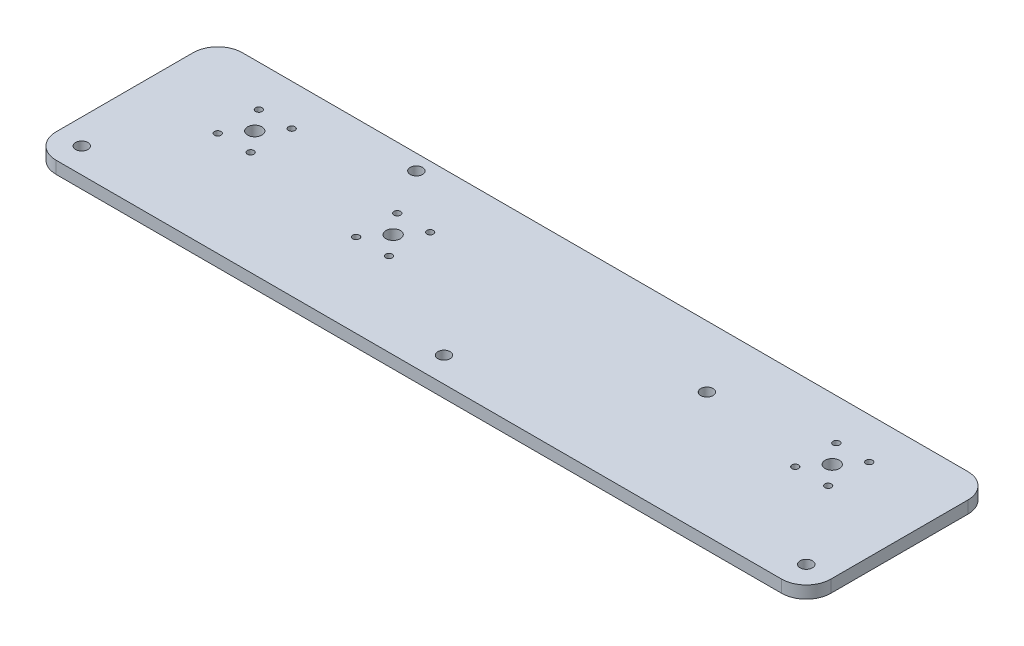
ISO-10303-21;
HEADER;
FILE_DESCRIPTION(('STEP AP214'),'2;1');
FILE_NAME('part.step','',(''),(''),'','','');
FILE_SCHEMA(('AUTOMOTIVE_DESIGN { 1 0 10303 214 1 1 1 1 }'));
ENDSEC;
DATA;
#1=APPLICATION_CONTEXT('core data for automotive mechanical design processes');
#2=APPLICATION_PROTOCOL_DEFINITION('international standard','automotive_design',2000,#1);
#3=PRODUCT_CONTEXT('',#1,'mechanical');
#4=PRODUCT('Part','Part','',(#3));
#5=PRODUCT_RELATED_PRODUCT_CATEGORY('part','',(#4));
#6=PRODUCT_DEFINITION_FORMATION('','',#4);
#7=PRODUCT_DEFINITION_CONTEXT('part definition',#1,'design');
#8=PRODUCT_DEFINITION('design','',#6,#7);
#9=PRODUCT_DEFINITION_SHAPE('','',#8);
#10=(LENGTH_UNIT() NAMED_UNIT(*) SI_UNIT(.MILLI.,.METRE.));
#11=(NAMED_UNIT(*) PLANE_ANGLE_UNIT() SI_UNIT($,.RADIAN.));
#12=(NAMED_UNIT(*) SI_UNIT($,.STERADIAN.) SOLID_ANGLE_UNIT());
#13=UNCERTAINTY_MEASURE_WITH_UNIT(LENGTH_MEASURE(1.E-05),#10,'distance_accuracy_value','');
#14=(GEOMETRIC_REPRESENTATION_CONTEXT(3) GLOBAL_UNCERTAINTY_ASSIGNED_CONTEXT((#13)) GLOBAL_UNIT_ASSIGNED_CONTEXT((#10,
#11,#12)) REPRESENTATION_CONTEXT('',''));
#15=CARTESIAN_POINT('',(0.,0.,0.));
#16=DIRECTION('',(0.,0.,1.));
#17=DIRECTION('',(1.,0.,0.));
#18=AXIS2_PLACEMENT_3D('',#15,#16,#17);
#19=CARTESIAN_POINT('',(176.965018959203,-6.,38.6486976408852));
#20=DIRECTION('',(0.,1.,0.));
#21=DIRECTION('',(0.,0.,1.));
#22=AXIS2_PLACEMENT_3D('',#19,#20,#21);
#23=CYLINDRICAL_SURFACE('',#22,12.);
#24=CARTESIAN_POINT('',(176.965018959203,0.,38.6486976408852));
#25=DIRECTION('',(0.,1.,0.));
#26=DIRECTION('',(0.,0.,1.));
#27=AXIS2_PLACEMENT_3D('',#24,#25,#26);
#28=CIRCLE('',#27,12.);
#29=CARTESIAN_POINT('',(176.965018959203,0.,50.6486976408852));
#30=VERTEX_POINT('',#29);
#31=CARTESIAN_POINT('',(188.965018959203,0.,38.6486976408851));
#32=VERTEX_POINT('',#31);
#33=EDGE_CURVE('E130',#30,#32,#28,.T.);
#34=ORIENTED_EDGE('',*,*,#33,.F.);
#35=DIRECTION('',(0.,1.,0.));
#36=VECTOR('',#35,1.);
#37=CARTESIAN_POINT('',(176.965018959203,-6.,50.6486976408852));
#38=LINE('',#37,#36);
#39=CARTESIAN_POINT('',(176.965018959203,-6.,50.6486976408852));
#40=VERTEX_POINT('',#39);
#41=EDGE_CURVE('E11',#40,#30,#38,.T.);
#42=ORIENTED_EDGE('',*,*,#41,.F.);
#43=CARTESIAN_POINT('',(176.965018959203,-6.,38.6486976408852));
#44=DIRECTION('',(0.,1.,0.));
#45=DIRECTION('',(0.,0.,1.));
#46=AXIS2_PLACEMENT_3D('',#43,#44,#45);
#47=CIRCLE('',#46,12.);
#48=CARTESIAN_POINT('',(188.965018959203,-6.,38.6486976408851));
#49=VERTEX_POINT('',#48);
#50=EDGE_CURVE('E151',#40,#49,#47,.T.);
#51=ORIENTED_EDGE('',*,*,#50,.T.);
#52=DIRECTION('',(0.,1.,0.));
#53=VECTOR('',#52,1.);
#54=CARTESIAN_POINT('',(188.965018959203,-6.,38.6486976408851));
#55=LINE('',#54,#53);
#56=EDGE_CURVE('E36',#49,#32,#55,.T.);
#57=ORIENTED_EDGE('',*,*,#56,.T.);
#58=EDGE_LOOP('',(#34,#42,#51,#57));
#59=FACE_BOUND('',#58,.T.);
#60=ADVANCED_FACE('F33',(#59),#23,.T.);
#61=CARTESIAN_POINT('',(-176.090826952667,-6.,50.6486976408852));
#62=DIRECTION('',(0.,0.,1.));
#63=DIRECTION('',(1.,0.,0.));
#64=AXIS2_PLACEMENT_3D('',#61,#62,#63);
#65=PLANE('',#64);
#66=DIRECTION('',(1.,0.,0.));
#67=VECTOR('',#66,1.);
#68=CARTESIAN_POINT('',(-176.090826952667,0.,50.6486976408852));
#69=LINE('',#68,#67);
#70=CARTESIAN_POINT('',(-176.090826952667,0.,50.6486976408852));
#71=VERTEX_POINT('',#70);
#72=EDGE_CURVE('E149',#71,#30,#69,.T.);
#73=ORIENTED_EDGE('',*,*,#72,.F.);
#74=DIRECTION('',(0.,1.,0.));
#75=VECTOR('',#74,1.);
#76=CARTESIAN_POINT('',(-176.090826952667,-6.,50.6486976408852));
#77=LINE('',#76,#75);
#78=CARTESIAN_POINT('',(-176.090826952667,-6.,50.6486976408852));
#79=VERTEX_POINT('',#78);
#80=EDGE_CURVE('E42',#79,#71,#77,.T.);
#81=ORIENTED_EDGE('',*,*,#80,.F.);
#82=DIRECTION('',(1.,0.,0.));
#83=VECTOR('',#82,1.);
#84=CARTESIAN_POINT('',(-176.090826952667,-6.,50.6486976408852));
#85=LINE('',#84,#83);
#86=EDGE_CURVE('E120',#79,#40,#85,.T.);
#87=ORIENTED_EDGE('',*,*,#86,.T.);
#88=ORIENTED_EDGE('',*,*,#41,.T.);
#89=EDGE_LOOP('',(#73,#81,#87,#88));
#90=FACE_BOUND('',#89,.T.);
#91=ADVANCED_FACE('F163',(#90),#65,.T.);
#92=CARTESIAN_POINT('',(-176.090826952667,-6.,38.6486976408852));
#93=DIRECTION('',(0.,1.,0.));
#94=DIRECTION('',(0.,0.,1.));
#95=AXIS2_PLACEMENT_3D('',#92,#93,#94);
#96=CYLINDRICAL_SURFACE('',#95,12.);
#97=CARTESIAN_POINT('',(-176.090826952667,0.,38.6486976408852));
#98=DIRECTION('',(0.,1.,0.));
#99=DIRECTION('',(0.,0.,1.));
#100=AXIS2_PLACEMENT_3D('',#97,#98,#99);
#101=CIRCLE('',#100,12.);
#102=CARTESIAN_POINT('',(-188.090826952667,0.,38.6486976408851));
#103=VERTEX_POINT('',#102);
#104=EDGE_CURVE('E107',#103,#71,#101,.T.);
#105=ORIENTED_EDGE('',*,*,#104,.F.);
#106=DIRECTION('',(0.,1.,0.));
#107=VECTOR('',#106,1.);
#108=CARTESIAN_POINT('',(-188.090826952667,-6.,38.6486976408851));
#109=LINE('',#108,#107);
#110=CARTESIAN_POINT('',(-188.090826952667,-6.,38.6486976408851));
#111=VERTEX_POINT('',#110);
#112=EDGE_CURVE('E102',#111,#103,#109,.T.);
#113=ORIENTED_EDGE('',*,*,#112,.F.);
#114=CARTESIAN_POINT('',(-176.090826952667,-6.,38.6486976408852));
#115=DIRECTION('',(0.,1.,0.));
#116=DIRECTION('',(0.,0.,1.));
#117=AXIS2_PLACEMENT_3D('',#114,#115,#116);
#118=CIRCLE('',#117,12.);
#119=EDGE_CURVE('E105',#111,#79,#118,.T.);
#120=ORIENTED_EDGE('',*,*,#119,.T.);
#121=ORIENTED_EDGE('',*,*,#80,.T.);
#122=EDGE_LOOP('',(#105,#113,#120,#121));
#123=FACE_BOUND('',#122,.T.);
#124=ADVANCED_FACE('F104',(#123),#96,.T.);
#125=CARTESIAN_POINT('',(-188.090826952667,-6.,-27.9999999999999));
#126=DIRECTION('',(-1.,0.,0.));
#127=DIRECTION('',(0.,0.,1.));
#128=AXIS2_PLACEMENT_3D('',#125,#126,#127);
#129=PLANE('',#128);
#130=DIRECTION('',(0.,0.,1.));
#131=VECTOR('',#130,1.);
#132=CARTESIAN_POINT('',(-188.090826952667,0.,-27.9999999999999));
#133=LINE('',#132,#131);
#134=CARTESIAN_POINT('',(-188.090826952667,0.,-27.9999999999999));
#135=VERTEX_POINT('',#134);
#136=EDGE_CURVE('E146',#135,#103,#133,.T.);
#137=ORIENTED_EDGE('',*,*,#136,.F.);
#138=DIRECTION('',(0.,1.,0.));
#139=VECTOR('',#138,1.);
#140=CARTESIAN_POINT('',(-188.090826952667,-6.,-27.9999999999999));
#141=LINE('',#140,#139);
#142=CARTESIAN_POINT('',(-188.090826952667,-6.,-27.9999999999999));
#143=VERTEX_POINT('',#142);
#144=EDGE_CURVE('E112',#143,#135,#141,.T.);
#145=ORIENTED_EDGE('',*,*,#144,.F.);
#146=DIRECTION('',(0.,0.,1.));
#147=VECTOR('',#146,1.);
#148=CARTESIAN_POINT('',(-188.090826952667,-6.,-27.9999999999999));
#149=LINE('',#148,#147);
#150=EDGE_CURVE('E118',#143,#111,#149,.T.);
#151=ORIENTED_EDGE('',*,*,#150,.T.);
#152=ORIENTED_EDGE('',*,*,#112,.T.);
#153=EDGE_LOOP('',(#137,#145,#151,#152));
#154=FACE_BOUND('',#153,.T.);
#155=ADVANCED_FACE('F122',(#154),#129,.T.);
#156=CARTESIAN_POINT('',(-176.090826952667,-6.,-28.));
#157=DIRECTION('',(0.,1.,0.));
#158=DIRECTION('',(0.,0.,1.));
#159=AXIS2_PLACEMENT_3D('',#156,#157,#158);
#160=CYLINDRICAL_SURFACE('',#159,12.);
#161=CARTESIAN_POINT('',(-176.090826952667,0.,-28.));
#162=DIRECTION('',(0.,1.,0.));
#163=DIRECTION('',(0.,0.,-1.));
#164=AXIS2_PLACEMENT_3D('',#161,#162,#163);
#165=CIRCLE('',#164,12.);
#166=CARTESIAN_POINT('',(-176.090826952667,0.,-40.));
#167=VERTEX_POINT('',#166);
#168=EDGE_CURVE('E143',#167,#135,#165,.T.);
#169=ORIENTED_EDGE('',*,*,#168,.F.);
#170=DIRECTION('',(0.,1.,0.));
#171=VECTOR('',#170,1.);
#172=CARTESIAN_POINT('',(-176.090826952667,-6.,-40.));
#173=LINE('',#172,#171);
#174=CARTESIAN_POINT('',(-176.090826952667,-6.,-40.));
#175=VERTEX_POINT('',#174);
#176=EDGE_CURVE('E155',#175,#167,#173,.T.);
#177=ORIENTED_EDGE('',*,*,#176,.F.);
#178=CARTESIAN_POINT('',(-176.090826952667,-6.,-28.));
#179=DIRECTION('',(0.,1.,0.));
#180=DIRECTION('',(0.,0.,-1.));
#181=AXIS2_PLACEMENT_3D('',#178,#179,#180);
#182=CIRCLE('',#181,12.);
#183=EDGE_CURVE('E123',#175,#143,#182,.T.);
#184=ORIENTED_EDGE('',*,*,#183,.T.);
#185=ORIENTED_EDGE('',*,*,#144,.T.);
#186=EDGE_LOOP('',(#169,#177,#184,#185));
#187=FACE_BOUND('',#186,.T.);
#188=ADVANCED_FACE('F176',(#187),#160,.T.);
#189=CARTESIAN_POINT('',(176.965018959203,-6.,-40.));
#190=DIRECTION('',(0.,0.,-1.));
#191=DIRECTION('',(-1.,0.,0.));
#192=AXIS2_PLACEMENT_3D('',#189,#190,#191);
#193=PLANE('',#192);
#194=DIRECTION('',(-1.,0.,0.));
#195=VECTOR('',#194,1.);
#196=CARTESIAN_POINT('',(176.965018959203,0.,-40.));
#197=LINE('',#196,#195);
#198=CARTESIAN_POINT('',(176.965018959203,0.,-40.));
#199=VERTEX_POINT('',#198);
#200=EDGE_CURVE('E140',#199,#167,#197,.T.);
#201=ORIENTED_EDGE('',*,*,#200,.F.);
#202=DIRECTION('',(0.,1.,0.));
#203=VECTOR('',#202,1.);
#204=CARTESIAN_POINT('',(176.965018959203,-6.,-40.));
#205=LINE('',#204,#203);
#206=CARTESIAN_POINT('',(176.965018959203,-6.,-40.));
#207=VERTEX_POINT('',#206);
#208=EDGE_CURVE('E157',#207,#199,#205,.T.);
#209=ORIENTED_EDGE('',*,*,#208,.F.);
#210=DIRECTION('',(-1.,0.,0.));
#211=VECTOR('',#210,1.);
#212=CARTESIAN_POINT('',(176.965018959203,-6.,-40.));
#213=LINE('',#212,#211);
#214=EDGE_CURVE('E125',#207,#175,#213,.T.);
#215=ORIENTED_EDGE('',*,*,#214,.T.);
#216=ORIENTED_EDGE('',*,*,#176,.T.);
#217=EDGE_LOOP('',(#201,#209,#215,#216));
#218=FACE_BOUND('',#217,.T.);
#219=ADVANCED_FACE('F179',(#218),#193,.T.);
#220=CARTESIAN_POINT('',(176.965018959203,-6.,-28.));
#221=DIRECTION('',(0.,1.,0.));
#222=DIRECTION('',(0.,0.,1.));
#223=AXIS2_PLACEMENT_3D('',#220,#221,#222);
#224=CYLINDRICAL_SURFACE('',#223,12.);
#225=CARTESIAN_POINT('',(176.965018959203,0.,-28.));
#226=DIRECTION('',(0.,1.,0.));
#227=DIRECTION('',(0.,0.,1.));
#228=AXIS2_PLACEMENT_3D('',#225,#226,#227);
#229=CIRCLE('',#228,12.);
#230=CARTESIAN_POINT('',(188.965018959203,0.,-27.9999999999999));
#231=VERTEX_POINT('',#230);
#232=EDGE_CURVE('E137',#231,#199,#229,.T.);
#233=ORIENTED_EDGE('',*,*,#232,.F.);
#234=DIRECTION('',(0.,1.,0.));
#235=VECTOR('',#234,1.);
#236=CARTESIAN_POINT('',(188.965018959203,-6.,-27.9999999999999));
#237=LINE('',#236,#235);
#238=CARTESIAN_POINT('',(188.965018959203,-6.,-27.9999999999999));
#239=VERTEX_POINT('',#238);
#240=EDGE_CURVE('E158',#239,#231,#237,.T.);
#241=ORIENTED_EDGE('',*,*,#240,.F.);
#242=CARTESIAN_POINT('',(176.965018959203,-6.,-28.));
#243=DIRECTION('',(0.,1.,0.));
#244=DIRECTION('',(0.,0.,1.));
#245=AXIS2_PLACEMENT_3D('',#242,#243,#244);
#246=CIRCLE('',#245,12.);
#247=EDGE_CURVE('E405',#239,#207,#246,.T.);
#248=ORIENTED_EDGE('',*,*,#247,.T.);
#249=ORIENTED_EDGE('',*,*,#208,.T.);
#250=EDGE_LOOP('',(#233,#241,#248,#249));
#251=FACE_BOUND('',#250,.T.);
#252=ADVANCED_FACE('F183',(#251),#224,.T.);
#253=CARTESIAN_POINT('',(188.965018959203,-6.,38.6486976408851));
#254=DIRECTION('',(1.,0.,0.));
#255=DIRECTION('',(0.,0.,-1.));
#256=AXIS2_PLACEMENT_3D('',#253,#254,#255);
#257=PLANE('',#256);
#258=DIRECTION('',(0.,0.,-1.));
#259=VECTOR('',#258,1.);
#260=CARTESIAN_POINT('',(188.965018959203,0.,38.6486976408851));
#261=LINE('',#260,#259);
#262=EDGE_CURVE('E133',#32,#231,#261,.T.);
#263=ORIENTED_EDGE('',*,*,#262,.F.);
#264=ORIENTED_EDGE('',*,*,#56,.F.);
#265=DIRECTION('',(0.,0.,-1.));
#266=VECTOR('',#265,1.);
#267=CARTESIAN_POINT('',(188.965018959203,-6.,38.6486976408851));
#268=LINE('',#267,#266);
#269=EDGE_CURVE('E403',#49,#239,#268,.T.);
#270=ORIENTED_EDGE('',*,*,#269,.T.);
#271=ORIENTED_EDGE('',*,*,#240,.T.);
#272=EDGE_LOOP('',(#263,#264,#270,#271));
#273=FACE_BOUND('',#272,.T.);
#274=ADVANCED_FACE('F160',(#273),#257,.T.);
#275=CARTESIAN_POINT('',(176.965018959203,-6.,38.6486976408852));
#276=DIRECTION('',(0.,1.,0.));
#277=DIRECTION('',(0.,0.,1.));
#278=AXIS2_PLACEMENT_3D('',#275,#276,#277);
#279=PLANE('',#278);
#280=CARTESIAN_POINT('',(132.965018959203,-6.,-20.));
#281=DIRECTION('',(0.,1.,0.));
#282=DIRECTION('',(0.,0.,-1.));
#283=AXIS2_PLACEMENT_3D('',#280,#281,#282);
#284=CIRCLE('',#283,1.59999999999999);
#285=CARTESIAN_POINT('',(132.965018959203,-6.,-21.6));
#286=VERTEX_POINT('',#285);
#287=EDGE_CURVE('E282',#286,#286,#284,.T.);
#288=ORIENTED_EDGE('',*,*,#287,.T.);
#289=EDGE_LOOP('',(#288));
#290=FACE_BOUND('',#289,.T.);
#291=CARTESIAN_POINT('',(132.965018959203,-6.,0.));
#292=DIRECTION('',(0.,1.,0.));
#293=DIRECTION('',(0.,0.,-1.));
#294=AXIS2_PLACEMENT_3D('',#291,#292,#293);
#295=CIRCLE('',#294,1.59999999999999);
#296=CARTESIAN_POINT('',(132.965018959203,-6.,-1.60000000000009));
#297=VERTEX_POINT('',#296);
#298=EDGE_CURVE('E290',#297,#297,#295,.T.);
#299=ORIENTED_EDGE('',*,*,#298,.T.);
#300=EDGE_LOOP('',(#299));
#301=FACE_BOUND('',#300,.T.);
#302=CARTESIAN_POINT('',(148.965018959203,-6.,-20.));
#303=DIRECTION('',(0.,1.,0.));
#304=DIRECTION('',(0.,0.,-1.));
#305=AXIS2_PLACEMENT_3D('',#302,#303,#304);
#306=CIRCLE('',#305,1.59999999999999);
#307=CARTESIAN_POINT('',(148.965018959203,-6.,-21.6));
#308=VERTEX_POINT('',#307);
#309=EDGE_CURVE('E296',#308,#308,#306,.T.);
#310=ORIENTED_EDGE('',*,*,#309,.T.);
#311=EDGE_LOOP('',(#310));
#312=FACE_BOUND('',#311,.T.);
#313=CARTESIAN_POINT('',(148.965018959203,-6.,0.));
#314=DIRECTION('',(0.,1.,0.));
#315=DIRECTION('',(0.,0.,-1.));
#316=AXIS2_PLACEMENT_3D('',#313,#314,#315);
#317=CIRCLE('',#316,1.59999999999999);
#318=CARTESIAN_POINT('',(148.965018959203,-6.,-1.60000000000009));
#319=VERTEX_POINT('',#318);
#320=EDGE_CURVE('E302',#319,#319,#317,.T.);
#321=ORIENTED_EDGE('',*,*,#320,.T.);
#322=EDGE_LOOP('',(#321));
#323=FACE_BOUND('',#322,.T.);
#324=CARTESIAN_POINT('',(140.965018959203,-6.,-10.));
#325=DIRECTION('',(0.,1.,0.));
#326=DIRECTION('',(0.,0.,-1.));
#327=AXIS2_PLACEMENT_3D('',#324,#325,#326);
#328=CIRCLE('',#327,3.49999999999999);
#329=CARTESIAN_POINT('',(140.965018959203,-6.,-13.5));
#330=VERTEX_POINT('',#329);
#331=EDGE_CURVE('E308',#330,#330,#328,.T.);
#332=ORIENTED_EDGE('',*,*,#331,.T.);
#333=EDGE_LOOP('',(#332));
#334=FACE_BOUND('',#333,.T.);
#335=CARTESIAN_POINT('',(-175.873946952667,-6.,38.4318176408857));
#336=DIRECTION('',(0.,1.,0.));
#337=DIRECTION('',(0.,0.,-1.));
#338=AXIS2_PLACEMENT_3D('',#335,#336,#337);
#339=CIRCLE('',#338,2.99999999999999);
#340=CARTESIAN_POINT('',(-175.873946952667,-6.,35.4318176408857));
#341=VERTEX_POINT('',#340);
#342=EDGE_CURVE('E314',#341,#341,#339,.T.);
#343=ORIENTED_EDGE('',*,*,#342,.T.);
#344=EDGE_LOOP('',(#343));
#345=FACE_BOUND('',#344,.T.);
#346=CARTESIAN_POINT('',(-83.9303426242627,-6.,-32.5));
#347=DIRECTION('',(0.,1.,0.));
#348=DIRECTION('',(0.,0.,-1.));
#349=AXIS2_PLACEMENT_3D('',#346,#347,#348);
#350=CIRCLE('',#349,3.00000000000001);
#351=CARTESIAN_POINT('',(-83.9303426242627,-6.,-35.5));
#352=VERTEX_POINT('',#351);
#353=EDGE_CURVE('E320',#352,#352,#350,.T.);
#354=ORIENTED_EDGE('',*,*,#353,.T.);
#355=EDGE_LOOP('',(#354));
#356=FACE_BOUND('',#355,.T.);
#357=CARTESIAN_POINT('',(-54.7345091762971,-6.,10.));
#358=DIRECTION('',(0.,1.,0.));
#359=DIRECTION('',(0.,0.,1.));
#360=AXIS2_PLACEMENT_3D('',#357,#358,#359);
#361=CIRCLE('',#360,1.6);
#362=CARTESIAN_POINT('',(-54.7345091762971,-6.,11.6));
#363=VERTEX_POINT('',#362);
#364=EDGE_CURVE('E326',#363,#363,#361,.T.);
#365=ORIENTED_EDGE('',*,*,#364,.T.);
#366=EDGE_LOOP('',(#365));
#367=FACE_BOUND('',#366,.T.);
#368=CARTESIAN_POINT('',(-54.7345091762971,-6.,-9.99999999999997));
#369=DIRECTION('',(0.,1.,0.));
#370=DIRECTION('',(0.,0.,1.));
#371=AXIS2_PLACEMENT_3D('',#368,#369,#370);
#372=CIRCLE('',#371,1.6);
#373=CARTESIAN_POINT('',(-54.7345091762971,-6.,-8.39999999999997));
#374=VERTEX_POINT('',#373);
#375=EDGE_CURVE('E332',#374,#374,#372,.T.);
#376=ORIENTED_EDGE('',*,*,#375,.T.);
#377=EDGE_LOOP('',(#376));
#378=FACE_BOUND('',#377,.T.);
#379=CARTESIAN_POINT('',(-70.7345091762971,-6.,-9.99999999999997));
#380=DIRECTION('',(0.,1.,0.));
#381=DIRECTION('',(0.,0.,1.));
#382=AXIS2_PLACEMENT_3D('',#379,#380,#381);
#383=CIRCLE('',#382,1.6);
#384=CARTESIAN_POINT('',(-70.7345091762971,-6.,-8.39999999999997));
#385=VERTEX_POINT('',#384);
#386=EDGE_CURVE('E338',#385,#385,#383,.T.);
#387=ORIENTED_EDGE('',*,*,#386,.T.);
#388=EDGE_LOOP('',(#387));
#389=FACE_BOUND('',#388,.T.);
#390=CARTESIAN_POINT('',(-70.7345091762971,-6.,10.));
#391=DIRECTION('',(0.,1.,0.));
#392=DIRECTION('',(0.,0.,1.));
#393=AXIS2_PLACEMENT_3D('',#390,#391,#392);
#394=CIRCLE('',#393,1.6);
#395=CARTESIAN_POINT('',(-70.7345091762971,-6.,11.6));
#396=VERTEX_POINT('',#395);
#397=EDGE_CURVE('E344',#396,#396,#394,.T.);
#398=ORIENTED_EDGE('',*,*,#397,.T.);
#399=EDGE_LOOP('',(#398));
#400=FACE_BOUND('',#399,.T.);
#401=CARTESIAN_POINT('',(-148.090826952667,-6.,-20.));
#402=DIRECTION('',(0.,1.,0.));
#403=DIRECTION('',(0.,0.,1.));
#404=AXIS2_PLACEMENT_3D('',#401,#402,#403);
#405=CIRCLE('',#404,1.59999999999999);
#406=CARTESIAN_POINT('',(-148.090826952667,-6.,-18.4));
#407=VERTEX_POINT('',#406);
#408=EDGE_CURVE('E350',#407,#407,#405,.T.);
#409=ORIENTED_EDGE('',*,*,#408,.T.);
#410=EDGE_LOOP('',(#409));
#411=FACE_BOUND('',#410,.T.);
#412=CARTESIAN_POINT('',(-132.090826952667,-6.,-20.));
#413=DIRECTION('',(0.,1.,0.));
#414=DIRECTION('',(0.,0.,1.));
#415=AXIS2_PLACEMENT_3D('',#412,#413,#414);
#416=CIRCLE('',#415,1.59999999999999);
#417=CARTESIAN_POINT('',(-132.090826952667,-6.,-18.4));
#418=VERTEX_POINT('',#417);
#419=EDGE_CURVE('E356',#418,#418,#416,.T.);
#420=ORIENTED_EDGE('',*,*,#419,.T.);
#421=EDGE_LOOP('',(#420));
#422=FACE_BOUND('',#421,.T.);
#423=CARTESIAN_POINT('',(-140.090826952667,-6.,-10.));
#424=DIRECTION('',(0.,1.,0.));
#425=DIRECTION('',(0.,0.,-1.));
#426=AXIS2_PLACEMENT_3D('',#423,#424,#425);
#427=CIRCLE('',#426,3.49999999999999);
#428=CARTESIAN_POINT('',(-140.090826952667,-6.,-13.5));
#429=VERTEX_POINT('',#428);
#430=EDGE_CURVE('E362',#429,#429,#427,.T.);
#431=ORIENTED_EDGE('',*,*,#430,.T.);
#432=EDGE_LOOP('',(#431));
#433=FACE_BOUND('',#432,.T.);
#434=CARTESIAN_POINT('',(79.9650189592034,-6.,-10.));
#435=DIRECTION('',(0.,1.,0.));
#436=DIRECTION('',(0.,0.,-1.));
#437=AXIS2_PLACEMENT_3D('',#434,#435,#436);
#438=CIRCLE('',#437,3.00000000000001);
#439=CARTESIAN_POINT('',(79.9650189592034,-6.,-13.0000000000001));
#440=VERTEX_POINT('',#439);
#441=EDGE_CURVE('E368',#440,#440,#438,.T.);
#442=ORIENTED_EDGE('',*,*,#441,.T.);
#443=EDGE_LOOP('',(#442));
#444=FACE_BOUND('',#443,.T.);
#445=CARTESIAN_POINT('',(0.437096003268411,-6.,38.4318176408857));
#446=DIRECTION('',(0.,1.,0.));
#447=DIRECTION('',(0.,0.,-1.));
#448=AXIS2_PLACEMENT_3D('',#445,#446,#447);
#449=CIRCLE('',#448,3.);
#450=CARTESIAN_POINT('',(0.437096003268411,-6.,35.4318176408857));
#451=VERTEX_POINT('',#450);
#452=EDGE_CURVE('E374',#451,#451,#449,.T.);
#453=ORIENTED_EDGE('',*,*,#452,.T.);
#454=EDGE_LOOP('',(#453));
#455=FACE_BOUND('',#454,.T.);
#456=CARTESIAN_POINT('',(176.748138959203,-6.,38.4318176408857));
#457=DIRECTION('',(0.,1.,0.));
#458=DIRECTION('',(0.,0.,-1.));
#459=AXIS2_PLACEMENT_3D('',#456,#457,#458);
#460=CIRCLE('',#459,2.99999999999999);
#461=CARTESIAN_POINT('',(176.748138959203,-6.,35.4318176408857));
#462=VERTEX_POINT('',#461);
#463=EDGE_CURVE('E380',#462,#462,#460,.T.);
#464=ORIENTED_EDGE('',*,*,#463,.T.);
#465=EDGE_LOOP('',(#464));
#466=FACE_BOUND('',#465,.T.);
#467=CARTESIAN_POINT('',(-62.7345091762972,-6.,0.));
#468=DIRECTION('',(0.,1.,0.));
#469=DIRECTION('',(0.,0.,-1.));
#470=AXIS2_PLACEMENT_3D('',#467,#468,#469);
#471=CIRCLE('',#470,3.5);
#472=CARTESIAN_POINT('',(-62.7345091762972,-6.,-3.49999999999997));
#473=VERTEX_POINT('',#472);
#474=EDGE_CURVE('E386',#473,#473,#471,.T.);
#475=ORIENTED_EDGE('',*,*,#474,.T.);
#476=EDGE_LOOP('',(#475));
#477=FACE_BOUND('',#476,.T.);
#478=CARTESIAN_POINT('',(-132.090826952667,-6.,0.));
#479=DIRECTION('',(0.,1.,0.));
#480=DIRECTION('',(0.,0.,1.));
#481=AXIS2_PLACEMENT_3D('',#478,#479,#480);
#482=CIRCLE('',#481,1.59999999999999);
#483=CARTESIAN_POINT('',(-132.090826952667,-6.,1.59999999999998));
#484=VERTEX_POINT('',#483);
#485=EDGE_CURVE('E392',#484,#484,#482,.T.);
#486=ORIENTED_EDGE('',*,*,#485,.T.);
#487=EDGE_LOOP('',(#486));
#488=FACE_BOUND('',#487,.T.);
#489=CARTESIAN_POINT('',(-148.090826952667,-6.,0.));
#490=DIRECTION('',(0.,1.,0.));
#491=DIRECTION('',(0.,0.,1.));
#492=AXIS2_PLACEMENT_3D('',#489,#490,#491);
#493=CIRCLE('',#492,1.59999999999999);
#494=CARTESIAN_POINT('',(-148.090826952667,-6.,1.59999999999998));
#495=VERTEX_POINT('',#494);
#496=EDGE_CURVE('E134',#495,#495,#493,.T.);
#497=ORIENTED_EDGE('',*,*,#496,.T.);
#498=EDGE_LOOP('',(#497));
#499=FACE_BOUND('',#498,.T.);
#500=ORIENTED_EDGE('',*,*,#50,.F.);
#501=ORIENTED_EDGE('',*,*,#86,.F.);
#502=ORIENTED_EDGE('',*,*,#119,.F.);
#503=ORIENTED_EDGE('',*,*,#150,.F.);
#504=ORIENTED_EDGE('',*,*,#183,.F.);
#505=ORIENTED_EDGE('',*,*,#214,.F.);
#506=ORIENTED_EDGE('',*,*,#247,.F.);
#507=ORIENTED_EDGE('',*,*,#269,.F.);
#508=EDGE_LOOP('',(#500,#501,#502,#503,#504,#505,#506,#507));
#509=FACE_BOUND('',#508,.T.);
#510=ADVANCED_FACE('F116',(#290,#301,#312,#323,#334,#345,#356,#367,#378,#389,#400,#411,#422,
#433,#444,#455,#466,#477,#488,#499,#509),#279,.F.);
#511=CARTESIAN_POINT('',(176.965018959203,0.,38.6486976408852));
#512=DIRECTION('',(0.,1.,0.));
#513=DIRECTION('',(0.,0.,1.));
#514=AXIS2_PLACEMENT_3D('',#511,#512,#513);
#515=PLANE('',#514);
#516=CARTESIAN_POINT('',(132.965018959203,0.,-20.));
#517=DIRECTION('',(0.,1.,0.));
#518=DIRECTION('',(0.,0.,-1.));
#519=AXIS2_PLACEMENT_3D('',#516,#517,#518);
#520=CIRCLE('',#519,1.59999999999999);
#521=CARTESIAN_POINT('',(132.965018959203,0.,-21.6));
#522=VERTEX_POINT('',#521);
#523=EDGE_CURVE('E285',#522,#522,#520,.T.);
#524=ORIENTED_EDGE('',*,*,#523,.F.);
#525=EDGE_LOOP('',(#524));
#526=FACE_BOUND('',#525,.T.);
#527=CARTESIAN_POINT('',(132.965018959203,0.,0.));
#528=DIRECTION('',(0.,1.,0.));
#529=DIRECTION('',(0.,0.,-1.));
#530=AXIS2_PLACEMENT_3D('',#527,#528,#529);
#531=CIRCLE('',#530,1.59999999999999);
#532=CARTESIAN_POINT('',(132.965018959203,0.,-1.60000000000009));
#533=VERTEX_POINT('',#532);
#534=EDGE_CURVE('E287',#533,#533,#531,.T.);
#535=ORIENTED_EDGE('',*,*,#534,.F.);
#536=EDGE_LOOP('',(#535));
#537=FACE_BOUND('',#536,.T.);
#538=CARTESIAN_POINT('',(148.965018959203,0.,-20.));
#539=DIRECTION('',(0.,1.,0.));
#540=DIRECTION('',(0.,0.,-1.));
#541=AXIS2_PLACEMENT_3D('',#538,#539,#540);
#542=CIRCLE('',#541,1.59999999999999);
#543=CARTESIAN_POINT('',(148.965018959203,0.,-21.6));
#544=VERTEX_POINT('',#543);
#545=EDGE_CURVE('E293',#544,#544,#542,.T.);
#546=ORIENTED_EDGE('',*,*,#545,.F.);
#547=EDGE_LOOP('',(#546));
#548=FACE_BOUND('',#547,.T.);
#549=CARTESIAN_POINT('',(148.965018959203,0.,0.));
#550=DIRECTION('',(0.,1.,0.));
#551=DIRECTION('',(0.,0.,-1.));
#552=AXIS2_PLACEMENT_3D('',#549,#550,#551);
#553=CIRCLE('',#552,1.59999999999999);
#554=CARTESIAN_POINT('',(148.965018959203,0.,-1.60000000000009));
#555=VERTEX_POINT('',#554);
#556=EDGE_CURVE('E299',#555,#555,#553,.T.);
#557=ORIENTED_EDGE('',*,*,#556,.F.);
#558=EDGE_LOOP('',(#557));
#559=FACE_BOUND('',#558,.T.);
#560=CARTESIAN_POINT('',(140.965018959203,0.,-10.));
#561=DIRECTION('',(0.,1.,0.));
#562=DIRECTION('',(0.,0.,-1.));
#563=AXIS2_PLACEMENT_3D('',#560,#561,#562);
#564=CIRCLE('',#563,3.49999999999999);
#565=CARTESIAN_POINT('',(140.965018959203,0.,-13.5));
#566=VERTEX_POINT('',#565);
#567=EDGE_CURVE('E305',#566,#566,#564,.T.);
#568=ORIENTED_EDGE('',*,*,#567,.F.);
#569=EDGE_LOOP('',(#568));
#570=FACE_BOUND('',#569,.T.);
#571=CARTESIAN_POINT('',(-175.873946952667,0.,38.4318176408857));
#572=DIRECTION('',(0.,1.,0.));
#573=DIRECTION('',(0.,0.,-1.));
#574=AXIS2_PLACEMENT_3D('',#571,#572,#573);
#575=CIRCLE('',#574,2.99999999999999);
#576=CARTESIAN_POINT('',(-175.873946952667,0.,35.4318176408857));
#577=VERTEX_POINT('',#576);
#578=EDGE_CURVE('E311',#577,#577,#575,.T.);
#579=ORIENTED_EDGE('',*,*,#578,.F.);
#580=EDGE_LOOP('',(#579));
#581=FACE_BOUND('',#580,.T.);
#582=CARTESIAN_POINT('',(-83.9303426242627,0.,-32.5));
#583=DIRECTION('',(0.,1.,0.));
#584=DIRECTION('',(0.,0.,-1.));
#585=AXIS2_PLACEMENT_3D('',#582,#583,#584);
#586=CIRCLE('',#585,3.00000000000001);
#587=CARTESIAN_POINT('',(-83.9303426242627,0.,-35.5));
#588=VERTEX_POINT('',#587);
#589=EDGE_CURVE('E317',#588,#588,#586,.T.);
#590=ORIENTED_EDGE('',*,*,#589,.F.);
#591=EDGE_LOOP('',(#590));
#592=FACE_BOUND('',#591,.T.);
#593=CARTESIAN_POINT('',(-54.7345091762971,0.,10.));
#594=DIRECTION('',(0.,1.,0.));
#595=DIRECTION('',(0.,0.,1.));
#596=AXIS2_PLACEMENT_3D('',#593,#594,#595);
#597=CIRCLE('',#596,1.6);
#598=CARTESIAN_POINT('',(-54.7345091762971,0.,11.6));
#599=VERTEX_POINT('',#598);
#600=EDGE_CURVE('E323',#599,#599,#597,.T.);
#601=ORIENTED_EDGE('',*,*,#600,.F.);
#602=EDGE_LOOP('',(#601));
#603=FACE_BOUND('',#602,.T.);
#604=CARTESIAN_POINT('',(-54.7345091762971,0.,-9.99999999999997));
#605=DIRECTION('',(0.,1.,0.));
#606=DIRECTION('',(0.,0.,1.));
#607=AXIS2_PLACEMENT_3D('',#604,#605,#606);
#608=CIRCLE('',#607,1.6);
#609=CARTESIAN_POINT('',(-54.7345091762971,0.,-8.39999999999997));
#610=VERTEX_POINT('',#609);
#611=EDGE_CURVE('E329',#610,#610,#608,.T.);
#612=ORIENTED_EDGE('',*,*,#611,.F.);
#613=EDGE_LOOP('',(#612));
#614=FACE_BOUND('',#613,.T.);
#615=CARTESIAN_POINT('',(-70.7345091762971,0.,-9.99999999999997));
#616=DIRECTION('',(0.,1.,0.));
#617=DIRECTION('',(0.,0.,1.));
#618=AXIS2_PLACEMENT_3D('',#615,#616,#617);
#619=CIRCLE('',#618,1.6);
#620=CARTESIAN_POINT('',(-70.7345091762971,0.,-8.39999999999997));
#621=VERTEX_POINT('',#620);
#622=EDGE_CURVE('E335',#621,#621,#619,.T.);
#623=ORIENTED_EDGE('',*,*,#622,.F.);
#624=EDGE_LOOP('',(#623));
#625=FACE_BOUND('',#624,.T.);
#626=CARTESIAN_POINT('',(-70.7345091762971,0.,10.));
#627=DIRECTION('',(0.,1.,0.));
#628=DIRECTION('',(0.,0.,1.));
#629=AXIS2_PLACEMENT_3D('',#626,#627,#628);
#630=CIRCLE('',#629,1.6);
#631=CARTESIAN_POINT('',(-70.7345091762971,0.,11.6));
#632=VERTEX_POINT('',#631);
#633=EDGE_CURVE('E341',#632,#632,#630,.T.);
#634=ORIENTED_EDGE('',*,*,#633,.F.);
#635=EDGE_LOOP('',(#634));
#636=FACE_BOUND('',#635,.T.);
#637=CARTESIAN_POINT('',(-148.090826952667,0.,-20.));
#638=DIRECTION('',(0.,1.,0.));
#639=DIRECTION('',(0.,0.,1.));
#640=AXIS2_PLACEMENT_3D('',#637,#638,#639);
#641=CIRCLE('',#640,1.59999999999999);
#642=CARTESIAN_POINT('',(-148.090826952667,0.,-18.4));
#643=VERTEX_POINT('',#642);
#644=EDGE_CURVE('E347',#643,#643,#641,.T.);
#645=ORIENTED_EDGE('',*,*,#644,.F.);
#646=EDGE_LOOP('',(#645));
#647=FACE_BOUND('',#646,.T.);
#648=CARTESIAN_POINT('',(-132.090826952667,0.,-20.));
#649=DIRECTION('',(0.,1.,0.));
#650=DIRECTION('',(0.,0.,1.));
#651=AXIS2_PLACEMENT_3D('',#648,#649,#650);
#652=CIRCLE('',#651,1.59999999999999);
#653=CARTESIAN_POINT('',(-132.090826952667,0.,-18.4));
#654=VERTEX_POINT('',#653);
#655=EDGE_CURVE('E353',#654,#654,#652,.T.);
#656=ORIENTED_EDGE('',*,*,#655,.F.);
#657=EDGE_LOOP('',(#656));
#658=FACE_BOUND('',#657,.T.);
#659=CARTESIAN_POINT('',(-140.090826952667,0.,-10.));
#660=DIRECTION('',(0.,1.,0.));
#661=DIRECTION('',(0.,0.,-1.));
#662=AXIS2_PLACEMENT_3D('',#659,#660,#661);
#663=CIRCLE('',#662,3.49999999999999);
#664=CARTESIAN_POINT('',(-140.090826952667,0.,-13.5));
#665=VERTEX_POINT('',#664);
#666=EDGE_CURVE('E359',#665,#665,#663,.T.);
#667=ORIENTED_EDGE('',*,*,#666,.F.);
#668=EDGE_LOOP('',(#667));
#669=FACE_BOUND('',#668,.T.);
#670=CARTESIAN_POINT('',(79.9650189592034,0.,-10.));
#671=DIRECTION('',(0.,1.,0.));
#672=DIRECTION('',(0.,0.,-1.));
#673=AXIS2_PLACEMENT_3D('',#670,#671,#672);
#674=CIRCLE('',#673,3.00000000000001);
#675=CARTESIAN_POINT('',(79.9650189592034,0.,-13.0000000000001));
#676=VERTEX_POINT('',#675);
#677=EDGE_CURVE('E365',#676,#676,#674,.T.);
#678=ORIENTED_EDGE('',*,*,#677,.F.);
#679=EDGE_LOOP('',(#678));
#680=FACE_BOUND('',#679,.T.);
#681=CARTESIAN_POINT('',(0.437096003268411,0.,38.4318176408857));
#682=DIRECTION('',(0.,1.,0.));
#683=DIRECTION('',(0.,0.,-1.));
#684=AXIS2_PLACEMENT_3D('',#681,#682,#683);
#685=CIRCLE('',#684,3.);
#686=CARTESIAN_POINT('',(0.437096003268411,0.,35.4318176408857));
#687=VERTEX_POINT('',#686);
#688=EDGE_CURVE('E371',#687,#687,#685,.T.);
#689=ORIENTED_EDGE('',*,*,#688,.F.);
#690=EDGE_LOOP('',(#689));
#691=FACE_BOUND('',#690,.T.);
#692=CARTESIAN_POINT('',(176.748138959203,0.,38.4318176408857));
#693=DIRECTION('',(0.,1.,0.));
#694=DIRECTION('',(0.,0.,-1.));
#695=AXIS2_PLACEMENT_3D('',#692,#693,#694);
#696=CIRCLE('',#695,2.99999999999999);
#697=CARTESIAN_POINT('',(176.748138959203,0.,35.4318176408857));
#698=VERTEX_POINT('',#697);
#699=EDGE_CURVE('E377',#698,#698,#696,.T.);
#700=ORIENTED_EDGE('',*,*,#699,.F.);
#701=EDGE_LOOP('',(#700));
#702=FACE_BOUND('',#701,.T.);
#703=CARTESIAN_POINT('',(-62.7345091762972,0.,0.));
#704=DIRECTION('',(0.,1.,0.));
#705=DIRECTION('',(0.,0.,-1.));
#706=AXIS2_PLACEMENT_3D('',#703,#704,#705);
#707=CIRCLE('',#706,3.5);
#708=CARTESIAN_POINT('',(-62.7345091762972,0.,-3.49999999999997));
#709=VERTEX_POINT('',#708);
#710=EDGE_CURVE('E383',#709,#709,#707,.T.);
#711=ORIENTED_EDGE('',*,*,#710,.F.);
#712=EDGE_LOOP('',(#711));
#713=FACE_BOUND('',#712,.T.);
#714=CARTESIAN_POINT('',(-132.090826952667,0.,0.));
#715=DIRECTION('',(0.,1.,0.));
#716=DIRECTION('',(0.,0.,1.));
#717=AXIS2_PLACEMENT_3D('',#714,#715,#716);
#718=CIRCLE('',#717,1.59999999999999);
#719=CARTESIAN_POINT('',(-132.090826952667,0.,1.59999999999998));
#720=VERTEX_POINT('',#719);
#721=EDGE_CURVE('E389',#720,#720,#718,.T.);
#722=ORIENTED_EDGE('',*,*,#721,.F.);
#723=EDGE_LOOP('',(#722));
#724=FACE_BOUND('',#723,.T.);
#725=CARTESIAN_POINT('',(-148.090826952667,0.,0.));
#726=DIRECTION('',(0.,1.,0.));
#727=DIRECTION('',(0.,0.,1.));
#728=AXIS2_PLACEMENT_3D('',#725,#726,#727);
#729=CIRCLE('',#728,1.59999999999999);
#730=CARTESIAN_POINT('',(-148.090826952667,0.,1.59999999999998));
#731=VERTEX_POINT('',#730);
#732=EDGE_CURVE('E395',#731,#731,#729,.T.);
#733=ORIENTED_EDGE('',*,*,#732,.F.);
#734=EDGE_LOOP('',(#733));
#735=FACE_BOUND('',#734,.T.);
#736=ORIENTED_EDGE('',*,*,#33,.T.);
#737=ORIENTED_EDGE('',*,*,#262,.T.);
#738=ORIENTED_EDGE('',*,*,#232,.T.);
#739=ORIENTED_EDGE('',*,*,#200,.T.);
#740=ORIENTED_EDGE('',*,*,#168,.T.);
#741=ORIENTED_EDGE('',*,*,#136,.T.);
#742=ORIENTED_EDGE('',*,*,#104,.T.);
#743=ORIENTED_EDGE('',*,*,#72,.T.);
#744=EDGE_LOOP('',(#736,#737,#738,#739,#740,#741,#742,#743));
#745=FACE_BOUND('',#744,.T.);
#746=ADVANCED_FACE('F162',(#526,#537,#548,#559,#570,#581,#592,#603,#614,#625,#636,#647,#658,
#669,#680,#691,#702,#713,#724,#735,#745),#515,.T.);
#747=CARTESIAN_POINT('',(-148.090826952667,-6.,0.));
#748=DIRECTION('',(0.,1.,0.));
#749=DIRECTION('',(0.,0.,1.));
#750=AXIS2_PLACEMENT_3D('',#747,#748,#749);
#751=CYLINDRICAL_SURFACE('',#750,1.59999999999999);
#752=ORIENTED_EDGE('',*,*,#496,.F.);
#753=EDGE_LOOP('',(#752));
#754=FACE_BOUND('',#753,.T.);
#755=ORIENTED_EDGE('',*,*,#732,.T.);
#756=EDGE_LOOP('',(#755));
#757=FACE_BOUND('',#756,.T.);
#758=ADVANCED_FACE('F195',(#754,#757),#751,.F.);
#759=CARTESIAN_POINT('',(-132.090826952667,-6.,0.));
#760=DIRECTION('',(0.,1.,0.));
#761=DIRECTION('',(0.,0.,1.));
#762=AXIS2_PLACEMENT_3D('',#759,#760,#761);
#763=CYLINDRICAL_SURFACE('',#762,1.59999999999999);
#764=ORIENTED_EDGE('',*,*,#485,.F.);
#765=EDGE_LOOP('',(#764));
#766=FACE_BOUND('',#765,.T.);
#767=ORIENTED_EDGE('',*,*,#721,.T.);
#768=EDGE_LOOP('',(#767));
#769=FACE_BOUND('',#768,.T.);
#770=ADVANCED_FACE('F202',(#766,#769),#763,.F.);
#771=CARTESIAN_POINT('',(-62.7345091762972,-6.,0.));
#772=DIRECTION('',(0.,1.,0.));
#773=DIRECTION('',(0.,0.,1.));
#774=AXIS2_PLACEMENT_3D('',#771,#772,#773);
#775=CYLINDRICAL_SURFACE('',#774,3.5);
#776=ORIENTED_EDGE('',*,*,#474,.F.);
#777=EDGE_LOOP('',(#776));
#778=FACE_BOUND('',#777,.T.);
#779=ORIENTED_EDGE('',*,*,#710,.T.);
#780=EDGE_LOOP('',(#779));
#781=FACE_BOUND('',#780,.T.);
#782=ADVANCED_FACE('F206',(#778,#781),#775,.F.);
#783=CARTESIAN_POINT('',(176.748138959203,-6.,38.4318176408857));
#784=DIRECTION('',(0.,1.,0.));
#785=DIRECTION('',(0.,0.,1.));
#786=AXIS2_PLACEMENT_3D('',#783,#784,#785);
#787=CYLINDRICAL_SURFACE('',#786,2.99999999999999);
#788=ORIENTED_EDGE('',*,*,#463,.F.);
#789=EDGE_LOOP('',(#788));
#790=FACE_BOUND('',#789,.T.);
#791=ORIENTED_EDGE('',*,*,#699,.T.);
#792=EDGE_LOOP('',(#791));
#793=FACE_BOUND('',#792,.T.);
#794=ADVANCED_FACE('F210',(#790,#793),#787,.F.);
#795=CARTESIAN_POINT('',(0.437096003268411,-6.,38.4318176408857));
#796=DIRECTION('',(0.,1.,0.));
#797=DIRECTION('',(0.,0.,1.));
#798=AXIS2_PLACEMENT_3D('',#795,#796,#797);
#799=CYLINDRICAL_SURFACE('',#798,3.);
#800=ORIENTED_EDGE('',*,*,#452,.F.);
#801=EDGE_LOOP('',(#800));
#802=FACE_BOUND('',#801,.T.);
#803=ORIENTED_EDGE('',*,*,#688,.T.);
#804=EDGE_LOOP('',(#803));
#805=FACE_BOUND('',#804,.T.);
#806=ADVANCED_FACE('F214',(#802,#805),#799,.F.);
#807=CARTESIAN_POINT('',(79.9650189592034,-6.,-10.));
#808=DIRECTION('',(0.,1.,0.));
#809=DIRECTION('',(0.,0.,1.));
#810=AXIS2_PLACEMENT_3D('',#807,#808,#809);
#811=CYLINDRICAL_SURFACE('',#810,3.00000000000001);
#812=ORIENTED_EDGE('',*,*,#441,.F.);
#813=EDGE_LOOP('',(#812));
#814=FACE_BOUND('',#813,.T.);
#815=ORIENTED_EDGE('',*,*,#677,.T.);
#816=EDGE_LOOP('',(#815));
#817=FACE_BOUND('',#816,.T.);
#818=ADVANCED_FACE('F218',(#814,#817),#811,.F.);
#819=CARTESIAN_POINT('',(-140.090826952667,-6.,-10.));
#820=DIRECTION('',(0.,1.,0.));
#821=DIRECTION('',(0.,0.,1.));
#822=AXIS2_PLACEMENT_3D('',#819,#820,#821);
#823=CYLINDRICAL_SURFACE('',#822,3.49999999999999);
#824=ORIENTED_EDGE('',*,*,#430,.F.);
#825=EDGE_LOOP('',(#824));
#826=FACE_BOUND('',#825,.T.);
#827=ORIENTED_EDGE('',*,*,#666,.T.);
#828=EDGE_LOOP('',(#827));
#829=FACE_BOUND('',#828,.T.);
#830=ADVANCED_FACE('F222',(#826,#829),#823,.F.);
#831=CARTESIAN_POINT('',(-132.090826952667,-6.,-20.));
#832=DIRECTION('',(0.,1.,0.));
#833=DIRECTION('',(0.,0.,1.));
#834=AXIS2_PLACEMENT_3D('',#831,#832,#833);
#835=CYLINDRICAL_SURFACE('',#834,1.59999999999999);
#836=ORIENTED_EDGE('',*,*,#419,.F.);
#837=EDGE_LOOP('',(#836));
#838=FACE_BOUND('',#837,.T.);
#839=ORIENTED_EDGE('',*,*,#655,.T.);
#840=EDGE_LOOP('',(#839));
#841=FACE_BOUND('',#840,.T.);
#842=ADVANCED_FACE('F226',(#838,#841),#835,.F.);
#843=CARTESIAN_POINT('',(-148.090826952667,-6.,-20.));
#844=DIRECTION('',(0.,1.,0.));
#845=DIRECTION('',(0.,0.,1.));
#846=AXIS2_PLACEMENT_3D('',#843,#844,#845);
#847=CYLINDRICAL_SURFACE('',#846,1.59999999999999);
#848=ORIENTED_EDGE('',*,*,#408,.F.);
#849=EDGE_LOOP('',(#848));
#850=FACE_BOUND('',#849,.T.);
#851=ORIENTED_EDGE('',*,*,#644,.T.);
#852=EDGE_LOOP('',(#851));
#853=FACE_BOUND('',#852,.T.);
#854=ADVANCED_FACE('F230',(#850,#853),#847,.F.);
#855=CARTESIAN_POINT('',(-70.7345091762971,-6.,10.));
#856=DIRECTION('',(0.,1.,0.));
#857=DIRECTION('',(0.,0.,1.));
#858=AXIS2_PLACEMENT_3D('',#855,#856,#857);
#859=CYLINDRICAL_SURFACE('',#858,1.6);
#860=ORIENTED_EDGE('',*,*,#397,.F.);
#861=EDGE_LOOP('',(#860));
#862=FACE_BOUND('',#861,.T.);
#863=ORIENTED_EDGE('',*,*,#633,.T.);
#864=EDGE_LOOP('',(#863));
#865=FACE_BOUND('',#864,.T.);
#866=ADVANCED_FACE('F234',(#862,#865),#859,.F.);
#867=CARTESIAN_POINT('',(-70.7345091762971,-6.,-9.99999999999997));
#868=DIRECTION('',(0.,1.,0.));
#869=DIRECTION('',(0.,0.,1.));
#870=AXIS2_PLACEMENT_3D('',#867,#868,#869);
#871=CYLINDRICAL_SURFACE('',#870,1.6);
#872=ORIENTED_EDGE('',*,*,#386,.F.);
#873=EDGE_LOOP('',(#872));
#874=FACE_BOUND('',#873,.T.);
#875=ORIENTED_EDGE('',*,*,#622,.T.);
#876=EDGE_LOOP('',(#875));
#877=FACE_BOUND('',#876,.T.);
#878=ADVANCED_FACE('F238',(#874,#877),#871,.F.);
#879=CARTESIAN_POINT('',(-54.7345091762971,-6.,-9.99999999999997));
#880=DIRECTION('',(0.,1.,0.));
#881=DIRECTION('',(0.,0.,1.));
#882=AXIS2_PLACEMENT_3D('',#879,#880,#881);
#883=CYLINDRICAL_SURFACE('',#882,1.6);
#884=ORIENTED_EDGE('',*,*,#375,.F.);
#885=EDGE_LOOP('',(#884));
#886=FACE_BOUND('',#885,.T.);
#887=ORIENTED_EDGE('',*,*,#611,.T.);
#888=EDGE_LOOP('',(#887));
#889=FACE_BOUND('',#888,.T.);
#890=ADVANCED_FACE('F242',(#886,#889),#883,.F.);
#891=CARTESIAN_POINT('',(-54.7345091762971,-6.,10.));
#892=DIRECTION('',(0.,1.,0.));
#893=DIRECTION('',(0.,0.,1.));
#894=AXIS2_PLACEMENT_3D('',#891,#892,#893);
#895=CYLINDRICAL_SURFACE('',#894,1.6);
#896=ORIENTED_EDGE('',*,*,#364,.F.);
#897=EDGE_LOOP('',(#896));
#898=FACE_BOUND('',#897,.T.);
#899=ORIENTED_EDGE('',*,*,#600,.T.);
#900=EDGE_LOOP('',(#899));
#901=FACE_BOUND('',#900,.T.);
#902=ADVANCED_FACE('F246',(#898,#901),#895,.F.);
#903=CARTESIAN_POINT('',(-83.9303426242627,-6.,-32.5));
#904=DIRECTION('',(0.,1.,0.));
#905=DIRECTION('',(0.,0.,1.));
#906=AXIS2_PLACEMENT_3D('',#903,#904,#905);
#907=CYLINDRICAL_SURFACE('',#906,3.00000000000001);
#908=ORIENTED_EDGE('',*,*,#353,.F.);
#909=EDGE_LOOP('',(#908));
#910=FACE_BOUND('',#909,.T.);
#911=ORIENTED_EDGE('',*,*,#589,.T.);
#912=EDGE_LOOP('',(#911));
#913=FACE_BOUND('',#912,.T.);
#914=ADVANCED_FACE('F250',(#910,#913),#907,.F.);
#915=CARTESIAN_POINT('',(-175.873946952667,-6.,38.4318176408857));
#916=DIRECTION('',(0.,1.,0.));
#917=DIRECTION('',(0.,0.,1.));
#918=AXIS2_PLACEMENT_3D('',#915,#916,#917);
#919=CYLINDRICAL_SURFACE('',#918,2.99999999999999);
#920=ORIENTED_EDGE('',*,*,#342,.F.);
#921=EDGE_LOOP('',(#920));
#922=FACE_BOUND('',#921,.T.);
#923=ORIENTED_EDGE('',*,*,#578,.T.);
#924=EDGE_LOOP('',(#923));
#925=FACE_BOUND('',#924,.T.);
#926=ADVANCED_FACE('F254',(#922,#925),#919,.F.);
#927=CARTESIAN_POINT('',(140.965018959203,-6.,-10.));
#928=DIRECTION('',(0.,1.,0.));
#929=DIRECTION('',(0.,0.,1.));
#930=AXIS2_PLACEMENT_3D('',#927,#928,#929);
#931=CYLINDRICAL_SURFACE('',#930,3.49999999999999);
#932=ORIENTED_EDGE('',*,*,#331,.F.);
#933=EDGE_LOOP('',(#932));
#934=FACE_BOUND('',#933,.T.);
#935=ORIENTED_EDGE('',*,*,#567,.T.);
#936=EDGE_LOOP('',(#935));
#937=FACE_BOUND('',#936,.T.);
#938=ADVANCED_FACE('F258',(#934,#937),#931,.F.);
#939=CARTESIAN_POINT('',(148.965018959203,-6.,0.));
#940=DIRECTION('',(0.,1.,0.));
#941=DIRECTION('',(0.,0.,1.));
#942=AXIS2_PLACEMENT_3D('',#939,#940,#941);
#943=CYLINDRICAL_SURFACE('',#942,1.59999999999999);
#944=ORIENTED_EDGE('',*,*,#320,.F.);
#945=EDGE_LOOP('',(#944));
#946=FACE_BOUND('',#945,.T.);
#947=ORIENTED_EDGE('',*,*,#556,.T.);
#948=EDGE_LOOP('',(#947));
#949=FACE_BOUND('',#948,.T.);
#950=ADVANCED_FACE('F262',(#946,#949),#943,.F.);
#951=CARTESIAN_POINT('',(148.965018959203,-6.,-20.));
#952=DIRECTION('',(0.,1.,0.));
#953=DIRECTION('',(0.,0.,1.));
#954=AXIS2_PLACEMENT_3D('',#951,#952,#953);
#955=CYLINDRICAL_SURFACE('',#954,1.59999999999999);
#956=ORIENTED_EDGE('',*,*,#309,.F.);
#957=EDGE_LOOP('',(#956));
#958=FACE_BOUND('',#957,.T.);
#959=ORIENTED_EDGE('',*,*,#545,.T.);
#960=EDGE_LOOP('',(#959));
#961=FACE_BOUND('',#960,.T.);
#962=ADVANCED_FACE('F266',(#958,#961),#955,.F.);
#963=CARTESIAN_POINT('',(132.965018959203,-6.,0.));
#964=DIRECTION('',(0.,1.,0.));
#965=DIRECTION('',(0.,0.,1.));
#966=AXIS2_PLACEMENT_3D('',#963,#964,#965);
#967=CYLINDRICAL_SURFACE('',#966,1.59999999999999);
#968=ORIENTED_EDGE('',*,*,#298,.F.);
#969=EDGE_LOOP('',(#968));
#970=FACE_BOUND('',#969,.T.);
#971=ORIENTED_EDGE('',*,*,#534,.T.);
#972=EDGE_LOOP('',(#971));
#973=FACE_BOUND('',#972,.T.);
#974=ADVANCED_FACE('F270',(#970,#973),#967,.F.);
#975=CARTESIAN_POINT('',(132.965018959203,-6.,-20.));
#976=DIRECTION('',(0.,1.,0.));
#977=DIRECTION('',(0.,0.,1.));
#978=AXIS2_PLACEMENT_3D('',#975,#976,#977);
#979=CYLINDRICAL_SURFACE('',#978,1.59999999999999);
#980=ORIENTED_EDGE('',*,*,#287,.F.);
#981=EDGE_LOOP('',(#980));
#982=FACE_BOUND('',#981,.T.);
#983=ORIENTED_EDGE('',*,*,#523,.T.);
#984=EDGE_LOOP('',(#983));
#985=FACE_BOUND('',#984,.T.);
#986=ADVANCED_FACE('F274',(#982,#985),#979,.F.);
#987=CLOSED_SHELL('',(#60,#91,#124,#155,#188,#219,#252,#274,#510,#746,#758,#770,#782,#794,#806,
#818,#830,#842,#854,#866,#878,#890,#902,#914,#926,#938,#950,#962,#974,#986));
#988=MANIFOLD_SOLID_BREP('B2',#987);
#989=ADVANCED_BREP_SHAPE_REPRESENTATION('',(#18,#988),#14);
#990=SHAPE_DEFINITION_REPRESENTATION(#9,#989);
ENDSEC;
END-ISO-10303-21;
